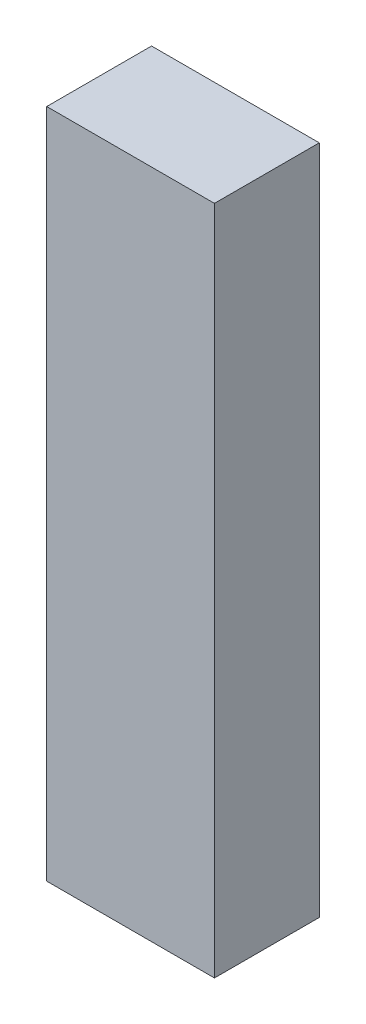
ISO-10303-21;
HEADER;
FILE_DESCRIPTION(('STEP AP214'),'2;1');
FILE_NAME('part.step','',(''),(''),'','','');
FILE_SCHEMA(('AUTOMOTIVE_DESIGN { 1 0 10303 214 1 1 1 1 }'));
ENDSEC;
DATA;
#1=APPLICATION_CONTEXT('core data for automotive mechanical design processes');
#2=APPLICATION_PROTOCOL_DEFINITION('international standard','automotive_design',2000,#1);
#3=PRODUCT_CONTEXT('',#1,'mechanical');
#4=PRODUCT('Part','Part','',(#3));
#5=PRODUCT_RELATED_PRODUCT_CATEGORY('part','',(#4));
#6=PRODUCT_DEFINITION_FORMATION('','',#4);
#7=PRODUCT_DEFINITION_CONTEXT('part definition',#1,'design');
#8=PRODUCT_DEFINITION('design','',#6,#7);
#9=PRODUCT_DEFINITION_SHAPE('','',#8);
#10=(LENGTH_UNIT() NAMED_UNIT(*) SI_UNIT(.MILLI.,.METRE.));
#11=(NAMED_UNIT(*) PLANE_ANGLE_UNIT() SI_UNIT($,.RADIAN.));
#12=(NAMED_UNIT(*) SI_UNIT($,.STERADIAN.) SOLID_ANGLE_UNIT());
#13=UNCERTAINTY_MEASURE_WITH_UNIT(LENGTH_MEASURE(1.E-05),#10,'distance_accuracy_value','');
#14=(GEOMETRIC_REPRESENTATION_CONTEXT(3) GLOBAL_UNCERTAINTY_ASSIGNED_CONTEXT((#13)) GLOBAL_UNIT_ASSIGNED_CONTEXT((#10,
#11,#12)) REPRESENTATION_CONTEXT('',''));
#15=CARTESIAN_POINT('',(0.,0.,0.));
#16=DIRECTION('',(0.,0.,1.));
#17=DIRECTION('',(1.,0.,0.));
#18=AXIS2_PLACEMENT_3D('',#15,#16,#17);
#19=CARTESIAN_POINT('',(-16.,-64.,-20.));
#20=DIRECTION('',(-1.,0.,0.));
#21=DIRECTION('',(0.,0.,1.));
#22=AXIS2_PLACEMENT_3D('',#19,#20,#21);
#23=PLANE('',#22);
#24=DIRECTION('',(0.,-1.,0.));
#25=VECTOR('',#24,1.);
#26=CARTESIAN_POINT('',(-16.,-64.,0.));
#27=LINE('',#26,#25);
#28=CARTESIAN_POINT('',(-16.,64.,0.));
#29=VERTEX_POINT('',#28);
#30=CARTESIAN_POINT('',(-16.,-64.,0.));
#31=VERTEX_POINT('',#30);
#32=EDGE_CURVE('E103',#29,#31,#27,.T.);
#33=ORIENTED_EDGE('',*,*,#32,.F.);
#34=DIRECTION('',(0.,0.,1.));
#35=VECTOR('',#34,1.);
#36=CARTESIAN_POINT('',(-16.,64.,-20.));
#37=LINE('',#36,#35);
#38=CARTESIAN_POINT('',(-16.,64.,-20.));
#39=VERTEX_POINT('',#38);
#40=EDGE_CURVE('E11',#39,#29,#37,.T.);
#41=ORIENTED_EDGE('',*,*,#40,.F.);
#42=DIRECTION('',(0.,-1.,0.));
#43=VECTOR('',#42,1.);
#44=CARTESIAN_POINT('',(-16.,-64.,-20.));
#45=LINE('',#44,#43);
#46=CARTESIAN_POINT('',(-16.,-64.,-20.));
#47=VERTEX_POINT('',#46);
#48=EDGE_CURVE('E97',#39,#47,#45,.T.);
#49=ORIENTED_EDGE('',*,*,#48,.T.);
#50=DIRECTION('',(0.,0.,1.));
#51=VECTOR('',#50,1.);
#52=CARTESIAN_POINT('',(-16.,-64.,-20.));
#53=LINE('',#52,#51);
#54=EDGE_CURVE('E42',#47,#31,#53,.T.);
#55=ORIENTED_EDGE('',*,*,#54,.T.);
#56=EDGE_LOOP('',(#33,#41,#49,#55));
#57=FACE_BOUND('',#56,.T.);
#58=ADVANCED_FACE('F39',(#57),#23,.T.);
#59=CARTESIAN_POINT('',(-16.,64.,-20.));
#60=DIRECTION('',(0.,1.,0.));
#61=DIRECTION('',(0.,0.,1.));
#62=AXIS2_PLACEMENT_3D('',#59,#60,#61);
#63=PLANE('',#62);
#64=DIRECTION('',(-1.,0.,0.));
#65=VECTOR('',#64,1.);
#66=CARTESIAN_POINT('',(-16.,64.,0.));
#67=LINE('',#66,#65);
#68=CARTESIAN_POINT('',(16.,64.,0.));
#69=VERTEX_POINT('',#68);
#70=EDGE_CURVE('E99',#69,#29,#67,.T.);
#71=ORIENTED_EDGE('',*,*,#70,.F.);
#72=DIRECTION('',(0.,0.,1.));
#73=VECTOR('',#72,1.);
#74=CARTESIAN_POINT('',(16.,64.,-20.));
#75=LINE('',#74,#73);
#76=CARTESIAN_POINT('',(16.,64.,-20.));
#77=VERTEX_POINT('',#76);
#78=EDGE_CURVE('E48',#77,#69,#75,.T.);
#79=ORIENTED_EDGE('',*,*,#78,.F.);
#80=DIRECTION('',(-1.,0.,0.));
#81=VECTOR('',#80,1.);
#82=CARTESIAN_POINT('',(-16.,64.,-20.));
#83=LINE('',#82,#81);
#84=EDGE_CURVE('E94',#77,#39,#83,.T.);
#85=ORIENTED_EDGE('',*,*,#84,.T.);
#86=ORIENTED_EDGE('',*,*,#40,.T.);
#87=EDGE_LOOP('',(#71,#79,#85,#86));
#88=FACE_BOUND('',#87,.T.);
#89=ADVANCED_FACE('F113',(#88),#63,.T.);
#90=CARTESIAN_POINT('',(16.,-64.,-20.));
#91=DIRECTION('',(1.,0.,0.));
#92=DIRECTION('',(0.,0.,-1.));
#93=AXIS2_PLACEMENT_3D('',#90,#91,#92);
#94=PLANE('',#93);
#95=DIRECTION('',(0.,1.,0.));
#96=VECTOR('',#95,1.);
#97=CARTESIAN_POINT('',(16.,-64.,0.));
#98=LINE('',#97,#96);
#99=CARTESIAN_POINT('',(16.,-64.,0.));
#100=VERTEX_POINT('',#99);
#101=EDGE_CURVE('E89',#100,#69,#98,.T.);
#102=ORIENTED_EDGE('',*,*,#101,.F.);
#103=DIRECTION('',(0.,0.,1.));
#104=VECTOR('',#103,1.);
#105=CARTESIAN_POINT('',(16.,-64.,-20.));
#106=LINE('',#105,#104);
#107=CARTESIAN_POINT('',(16.,-64.,-20.));
#108=VERTEX_POINT('',#107);
#109=EDGE_CURVE('E84',#108,#100,#106,.T.);
#110=ORIENTED_EDGE('',*,*,#109,.F.);
#111=DIRECTION('',(0.,1.,0.));
#112=VECTOR('',#111,1.);
#113=CARTESIAN_POINT('',(16.,-64.,-20.));
#114=LINE('',#113,#112);
#115=EDGE_CURVE('E87',#108,#77,#114,.T.);
#116=ORIENTED_EDGE('',*,*,#115,.T.);
#117=ORIENTED_EDGE('',*,*,#78,.T.);
#118=EDGE_LOOP('',(#102,#110,#116,#117));
#119=FACE_BOUND('',#118,.T.);
#120=ADVANCED_FACE('F86',(#119),#94,.T.);
#121=CARTESIAN_POINT('',(-16.,-64.,-20.));
#122=DIRECTION('',(0.,-1.,0.));
#123=DIRECTION('',(0.,0.,-1.));
#124=AXIS2_PLACEMENT_3D('',#121,#122,#123);
#125=PLANE('',#124);
#126=DIRECTION('',(1.,0.,0.));
#127=VECTOR('',#126,1.);
#128=CARTESIAN_POINT('',(-16.,-64.,0.));
#129=LINE('',#128,#127);
#130=EDGE_CURVE('E106',#31,#100,#129,.T.);
#131=ORIENTED_EDGE('',*,*,#130,.F.);
#132=ORIENTED_EDGE('',*,*,#54,.F.);
#133=DIRECTION('',(1.,0.,0.));
#134=VECTOR('',#133,1.);
#135=CARTESIAN_POINT('',(-16.,-64.,-20.));
#136=LINE('',#135,#134);
#137=EDGE_CURVE('E93',#47,#108,#136,.T.);
#138=ORIENTED_EDGE('',*,*,#137,.T.);
#139=ORIENTED_EDGE('',*,*,#109,.T.);
#140=EDGE_LOOP('',(#131,#132,#138,#139));
#141=FACE_BOUND('',#140,.T.);
#142=ADVANCED_FACE('F96',(#141),#125,.T.);
#143=CARTESIAN_POINT('',(0.,0.,-20.));
#144=DIRECTION('',(0.,0.,-1.));
#145=DIRECTION('',(-1.,0.,0.));
#146=AXIS2_PLACEMENT_3D('',#143,#144,#145);
#147=PLANE('',#146);
#148=ORIENTED_EDGE('',*,*,#48,.F.);
#149=ORIENTED_EDGE('',*,*,#84,.F.);
#150=ORIENTED_EDGE('',*,*,#115,.F.);
#151=ORIENTED_EDGE('',*,*,#137,.F.);
#152=EDGE_LOOP('',(#148,#149,#150,#151));
#153=FACE_BOUND('',#152,.T.);
#154=ADVANCED_FACE('F92',(#153),#147,.T.);
#155=CARTESIAN_POINT('',(0.,0.,0.));
#156=DIRECTION('',(0.,0.,-1.));
#157=DIRECTION('',(-1.,0.,0.));
#158=AXIS2_PLACEMENT_3D('',#155,#156,#157);
#159=PLANE('',#158);
#160=ORIENTED_EDGE('',*,*,#32,.T.);
#161=ORIENTED_EDGE('',*,*,#130,.T.);
#162=ORIENTED_EDGE('',*,*,#101,.T.);
#163=ORIENTED_EDGE('',*,*,#70,.T.);
#164=EDGE_LOOP('',(#160,#161,#162,#163));
#165=FACE_BOUND('',#164,.T.);
#166=ADVANCED_FACE('F112',(#165),#159,.F.);
#167=CLOSED_SHELL('',(#58,#89,#120,#142,#154,#166));
#168=MANIFOLD_SOLID_BREP('B2',#167);
#169=ADVANCED_BREP_SHAPE_REPRESENTATION('',(#18,#168),#14);
#170=SHAPE_DEFINITION_REPRESENTATION(#9,#169);
ENDSEC;
END-ISO-10303-21;
